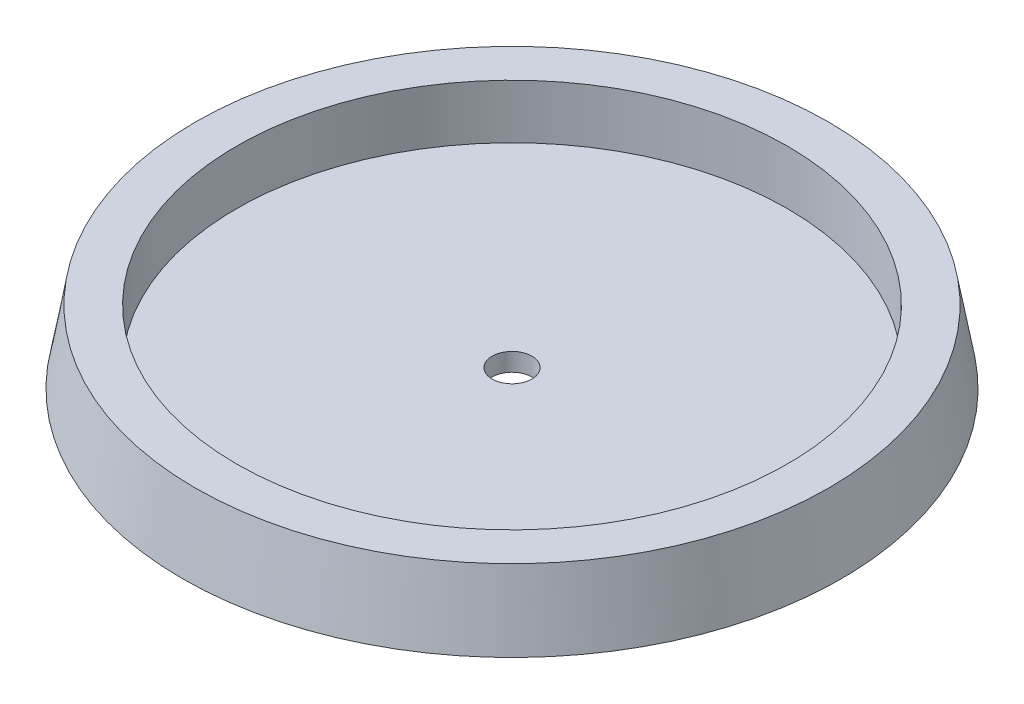
ISO-10303-21;
HEADER;
FILE_DESCRIPTION(('STEP AP214'),'2;1');
FILE_NAME('part.step','',(''),(''),'','','');
FILE_SCHEMA(('AUTOMOTIVE_DESIGN { 1 0 10303 214 1 1 1 1 }'));
ENDSEC;
DATA;
#1=APPLICATION_CONTEXT('core data for automotive mechanical design processes');
#2=APPLICATION_PROTOCOL_DEFINITION('international standard','automotive_design',2000,#1);
#3=PRODUCT_CONTEXT('',#1,'mechanical');
#4=PRODUCT('Part','Part','',(#3));
#5=PRODUCT_RELATED_PRODUCT_CATEGORY('part','',(#4));
#6=PRODUCT_DEFINITION_FORMATION('','',#4);
#7=PRODUCT_DEFINITION_CONTEXT('part definition',#1,'design');
#8=PRODUCT_DEFINITION('design','',#6,#7);
#9=PRODUCT_DEFINITION_SHAPE('','',#8);
#10=(LENGTH_UNIT() NAMED_UNIT(*) SI_UNIT(.MILLI.,.METRE.));
#11=(NAMED_UNIT(*) PLANE_ANGLE_UNIT() SI_UNIT($,.RADIAN.));
#12=(NAMED_UNIT(*) SI_UNIT($,.STERADIAN.) SOLID_ANGLE_UNIT());
#13=UNCERTAINTY_MEASURE_WITH_UNIT(LENGTH_MEASURE(1.E-05),#10,'distance_accuracy_value','');
#14=(GEOMETRIC_REPRESENTATION_CONTEXT(3) GLOBAL_UNCERTAINTY_ASSIGNED_CONTEXT((#13)) GLOBAL_UNIT_ASSIGNED_CONTEXT((#10,
#11,#12)) REPRESENTATION_CONTEXT('',''));
#15=CARTESIAN_POINT('',(0.,0.,0.));
#16=DIRECTION('',(0.,0.,1.));
#17=DIRECTION('',(1.,0.,0.));
#18=AXIS2_PLACEMENT_3D('',#15,#16,#17);
#19=CARTESIAN_POINT('',(0.,0.,0.));
#20=DIRECTION('',(0.,1.,0.));
#21=DIRECTION('',(0.,0.,1.));
#22=AXIS2_PLACEMENT_3D('',#19,#20,#21);
#23=CYLINDRICAL_SURFACE('',#22,1.1);
#24=CARTESIAN_POINT('',(0.,0.,0.));
#25=DIRECTION('',(0.,1.,0.));
#26=DIRECTION('',(0.,0.,1.));
#27=AXIS2_PLACEMENT_3D('',#24,#25,#26);
#28=CIRCLE('',#27,1.1);
#29=CARTESIAN_POINT('',(0.,0.,1.1));
#30=VERTEX_POINT('',#29);
#31=EDGE_CURVE('E58',#30,#30,#28,.T.);
#32=ORIENTED_EDGE('',*,*,#31,.F.);
#33=EDGE_LOOP('',(#32));
#34=FACE_BOUND('',#33,.T.);
#35=CARTESIAN_POINT('',(0.,1.,0.));
#36=DIRECTION('',(0.,1.,0.));
#37=DIRECTION('',(0.,0.,1.));
#38=AXIS2_PLACEMENT_3D('',#35,#36,#37);
#39=CIRCLE('',#38,1.1);
#40=CARTESIAN_POINT('',(0.,1.,1.1));
#41=VERTEX_POINT('',#40);
#42=EDGE_CURVE('E70',#41,#41,#39,.T.);
#43=ORIENTED_EDGE('',*,*,#42,.T.);
#44=EDGE_LOOP('',(#43));
#45=FACE_BOUND('',#44,.T.);
#46=ADVANCED_FACE('F45',(#34,#45),#23,.F.);
#47=CARTESIAN_POINT('',(0.,0.,0.));
#48=DIRECTION('',(0.,-1.,0.));
#49=DIRECTION('',(0.,0.,1.));
#50=AXIS2_PLACEMENT_3D('',#47,#48,#49);
#51=CONICAL_SURFACE('',#50,18.25,0.174532925199433);
#52=CARTESIAN_POINT('',(0.,4.,0.));
#53=DIRECTION('',(0.,1.,0.));
#54=DIRECTION('',(0.,0.,1.));
#55=AXIS2_PLACEMENT_3D('',#52,#53,#54);
#56=CIRCLE('',#55,17.5446920771661);
#57=CARTESIAN_POINT('',(0.,4.,17.5446920771661));
#58=VERTEX_POINT('',#57);
#59=EDGE_CURVE('E11',#58,#58,#56,.T.);
#60=ORIENTED_EDGE('',*,*,#59,.F.);
#61=EDGE_LOOP('',(#60));
#62=FACE_BOUND('',#61,.T.);
#63=CARTESIAN_POINT('',(0.,0.,0.));
#64=DIRECTION('',(0.,1.,0.));
#65=DIRECTION('',(0.,0.,1.));
#66=AXIS2_PLACEMENT_3D('',#63,#64,#65);
#67=CIRCLE('',#66,18.25);
#68=CARTESIAN_POINT('',(0.,0.,18.25));
#69=VERTEX_POINT('',#68);
#70=EDGE_CURVE('E53',#69,#69,#67,.T.);
#71=ORIENTED_EDGE('',*,*,#70,.T.);
#72=EDGE_LOOP('',(#71));
#73=FACE_BOUND('',#72,.T.);
#74=ADVANCED_FACE('F47',(#62,#73),#51,.T.);
#75=CARTESIAN_POINT('',(0.,4.,0.));
#76=DIRECTION('',(0.,1.,0.));
#77=DIRECTION('',(0.,0.,1.));
#78=AXIS2_PLACEMENT_3D('',#75,#76,#77);
#79=PLANE('',#78);
#80=CARTESIAN_POINT('',(0.,4.,0.));
#81=DIRECTION('',(0.,1.,0.));
#82=DIRECTION('',(0.,0.,1.));
#83=AXIS2_PLACEMENT_3D('',#80,#81,#82);
#84=CIRCLE('',#83,15.25);
#85=CARTESIAN_POINT('',(0.,4.,15.25));
#86=VERTEX_POINT('',#85);
#87=EDGE_CURVE('E66',#86,#86,#84,.T.);
#88=ORIENTED_EDGE('',*,*,#87,.F.);
#89=EDGE_LOOP('',(#88));
#90=FACE_BOUND('',#89,.T.);
#91=ORIENTED_EDGE('',*,*,#59,.T.);
#92=EDGE_LOOP('',(#91));
#93=FACE_BOUND('',#92,.T.);
#94=ADVANCED_FACE('F92',(#90,#93),#79,.T.);
#95=CARTESIAN_POINT('',(0.,0.,0.));
#96=DIRECTION('',(0.,1.,0.));
#97=DIRECTION('',(0.,0.,1.));
#98=AXIS2_PLACEMENT_3D('',#95,#96,#97);
#99=PLANE('',#98);
#100=ORIENTED_EDGE('',*,*,#31,.T.);
#101=EDGE_LOOP('',(#100));
#102=FACE_BOUND('',#101,.T.);
#103=ORIENTED_EDGE('',*,*,#70,.F.);
#104=EDGE_LOOP('',(#103));
#105=FACE_BOUND('',#104,.T.);
#106=ADVANCED_FACE('F88',(#102,#105),#99,.F.);
#107=CARTESIAN_POINT('',(0.,1.,0.));
#108=DIRECTION('',(0.,1.,0.));
#109=DIRECTION('',(0.,0.,1.));
#110=AXIS2_PLACEMENT_3D('',#107,#108,#109);
#111=CYLINDRICAL_SURFACE('',#110,15.25);
#112=CARTESIAN_POINT('',(0.,1.,0.));
#113=DIRECTION('',(0.,1.,0.));
#114=DIRECTION('',(0.,0.,1.));
#115=AXIS2_PLACEMENT_3D('',#112,#113,#114);
#116=CIRCLE('',#115,15.25);
#117=CARTESIAN_POINT('',(0.,1.,15.25));
#118=VERTEX_POINT('',#117);
#119=EDGE_CURVE('E63',#118,#118,#116,.T.);
#120=ORIENTED_EDGE('',*,*,#119,.F.);
#121=EDGE_LOOP('',(#120));
#122=FACE_BOUND('',#121,.T.);
#123=ORIENTED_EDGE('',*,*,#87,.T.);
#124=EDGE_LOOP('',(#123));
#125=FACE_BOUND('',#124,.T.);
#126=ADVANCED_FACE('F82',(#122,#125),#111,.F.);
#127=CARTESIAN_POINT('',(0.,1.,0.));
#128=DIRECTION('',(0.,1.,0.));
#129=DIRECTION('',(0.,0.,1.));
#130=AXIS2_PLACEMENT_3D('',#127,#128,#129);
#131=PLANE('',#130);
#132=ORIENTED_EDGE('',*,*,#42,.F.);
#133=EDGE_LOOP('',(#132));
#134=FACE_BOUND('',#133,.T.);
#135=ORIENTED_EDGE('',*,*,#119,.T.);
#136=EDGE_LOOP('',(#135));
#137=FACE_BOUND('',#136,.T.);
#138=ADVANCED_FACE('F79',(#134,#137),#131,.T.);
#139=CLOSED_SHELL('',(#46,#74,#94,#106,#126,#138));
#140=MANIFOLD_SOLID_BREP('B2',#139);
#141=ADVANCED_BREP_SHAPE_REPRESENTATION('',(#18,#140),#14);
#142=SHAPE_DEFINITION_REPRESENTATION(#9,#141);
ENDSEC;
END-ISO-10303-21;
